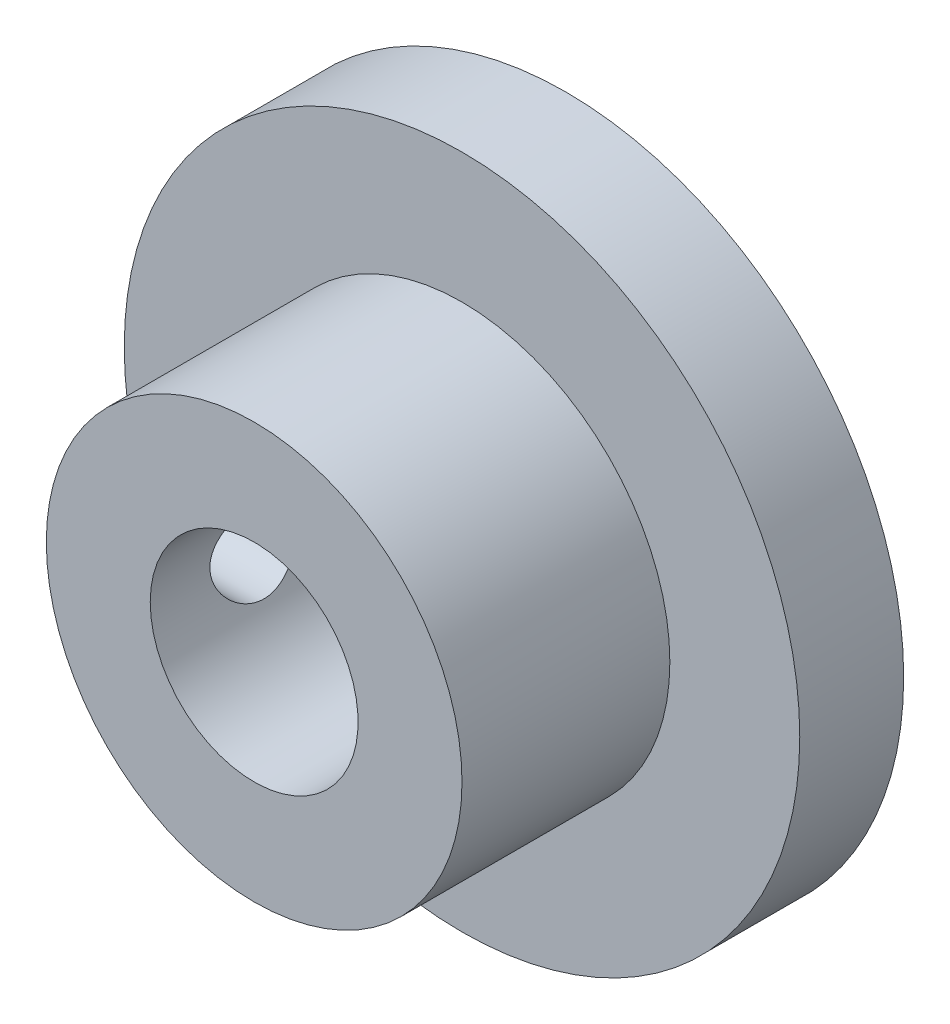
ISO-10303-21;
HEADER;
FILE_DESCRIPTION(('STEP AP214'),'2;1');
FILE_NAME('part.step','',(''),(''),'','','');
FILE_SCHEMA(('AUTOMOTIVE_DESIGN { 1 0 10303 214 1 1 1 1 }'));
ENDSEC;
DATA;
#1=APPLICATION_CONTEXT('core data for automotive mechanical design processes');
#2=APPLICATION_PROTOCOL_DEFINITION('international standard','automotive_design',2000,#1);
#3=PRODUCT_CONTEXT('',#1,'mechanical');
#4=PRODUCT('Part','Part','',(#3));
#5=PRODUCT_RELATED_PRODUCT_CATEGORY('part','',(#4));
#6=PRODUCT_DEFINITION_FORMATION('','',#4);
#7=PRODUCT_DEFINITION_CONTEXT('part definition',#1,'design');
#8=PRODUCT_DEFINITION('design','',#6,#7);
#9=PRODUCT_DEFINITION_SHAPE('','',#8);
#10=(LENGTH_UNIT() NAMED_UNIT(*) SI_UNIT(.MILLI.,.METRE.));
#11=(NAMED_UNIT(*) PLANE_ANGLE_UNIT() SI_UNIT($,.RADIAN.));
#12=(NAMED_UNIT(*) SI_UNIT($,.STERADIAN.) SOLID_ANGLE_UNIT());
#13=UNCERTAINTY_MEASURE_WITH_UNIT(LENGTH_MEASURE(1.E-05),#10,'distance_accuracy_value','');
#14=(GEOMETRIC_REPRESENTATION_CONTEXT(3) GLOBAL_UNCERTAINTY_ASSIGNED_CONTEXT((#13)) GLOBAL_UNIT_ASSIGNED_CONTEXT((#10,
#11,#12)) REPRESENTATION_CONTEXT('',''));
#15=CARTESIAN_POINT('',(0.,0.,0.));
#16=DIRECTION('',(0.,0.,1.));
#17=DIRECTION('',(1.,0.,0.));
#18=AXIS2_PLACEMENT_3D('',#15,#16,#17);
#19=CARTESIAN_POINT('',(0.,0.,3.175));
#20=DIRECTION('',(0.,0.,-1.));
#21=DIRECTION('',(-1.,0.,0.));
#22=AXIS2_PLACEMENT_3D('',#19,#20,#21);
#23=CYLINDRICAL_SURFACE('',#22,10.31875);
#24=CARTESIAN_POINT('',(0.,0.,3.175));
#25=DIRECTION('',(0.,0.,1.));
#26=DIRECTION('',(1.,0.,0.));
#27=AXIS2_PLACEMENT_3D('',#24,#25,#26);
#28=CIRCLE('',#27,10.31875);
#29=CARTESIAN_POINT('',(10.31875,0.,3.175));
#30=VERTEX_POINT('',#29);
#31=EDGE_CURVE('E54',#30,#30,#28,.T.);
#32=ORIENTED_EDGE('',*,*,#31,.F.);
#33=EDGE_LOOP('',(#32));
#34=FACE_BOUND('',#33,.T.);
#35=CARTESIAN_POINT('',(0.,0.,0.));
#36=DIRECTION('',(0.,0.,1.));
#37=DIRECTION('',(1.,0.,0.));
#38=AXIS2_PLACEMENT_3D('',#35,#36,#37);
#39=CIRCLE('',#38,10.31875);
#40=CARTESIAN_POINT('',(10.31875,0.,0.));
#41=VERTEX_POINT('',#40);
#42=EDGE_CURVE('E50',#41,#41,#39,.T.);
#43=ORIENTED_EDGE('',*,*,#42,.T.);
#44=EDGE_LOOP('',(#43));
#45=FACE_BOUND('',#44,.T.);
#46=ADVANCED_FACE('F47',(#34,#45),#23,.T.);
#47=CARTESIAN_POINT('',(0.,0.,3.175));
#48=DIRECTION('',(0.,0.,1.));
#49=DIRECTION('',(1.,0.,0.));
#50=AXIS2_PLACEMENT_3D('',#47,#48,#49);
#51=PLANE('',#50);
#52=CARTESIAN_POINT('',(0.,0.,3.175));
#53=DIRECTION('',(0.,0.,1.));
#54=DIRECTION('',(1.,0.,0.));
#55=AXIS2_PLACEMENT_3D('',#52,#53,#54);
#56=CIRCLE('',#55,6.35);
#57=CARTESIAN_POINT('',(6.35,0.,3.175));
#58=VERTEX_POINT('',#57);
#59=EDGE_CURVE('E12',#58,#58,#56,.T.);
#60=ORIENTED_EDGE('',*,*,#59,.F.);
#61=EDGE_LOOP('',(#60));
#62=FACE_BOUND('',#61,.T.);
#63=ORIENTED_EDGE('',*,*,#31,.T.);
#64=EDGE_LOOP('',(#63));
#65=FACE_BOUND('',#64,.T.);
#66=ADVANCED_FACE('F106',(#62,#65),#51,.T.);
#67=CARTESIAN_POINT('',(0.,0.,0.));
#68=DIRECTION('',(0.,0.,1.));
#69=DIRECTION('',(1.,0.,0.));
#70=AXIS2_PLACEMENT_3D('',#67,#68,#69);
#71=PLANE('',#70);
#72=CARTESIAN_POINT('',(0.,0.,0.));
#73=DIRECTION('',(0.,0.,-1.));
#74=DIRECTION('',(-1.,0.,0.));
#75=AXIS2_PLACEMENT_3D('',#72,#73,#74);
#76=CIRCLE('',#75,3.175);
#77=CARTESIAN_POINT('',(-3.175,0.,0.));
#78=VERTEX_POINT('',#77);
#79=EDGE_CURVE('E64',#78,#78,#76,.T.);
#80=ORIENTED_EDGE('',*,*,#79,.F.);
#81=EDGE_LOOP('',(#80));
#82=FACE_BOUND('',#81,.T.);
#83=ORIENTED_EDGE('',*,*,#42,.F.);
#84=EDGE_LOOP('',(#83));
#85=FACE_BOUND('',#84,.T.);
#86=ADVANCED_FACE('F102',(#82,#85),#71,.F.);
#87=CARTESIAN_POINT('',(0.,0.,9.525));
#88=DIRECTION('',(0.,0.,-1.));
#89=DIRECTION('',(-1.,0.,0.));
#90=AXIS2_PLACEMENT_3D('',#87,#88,#89);
#91=CYLINDRICAL_SURFACE('',#90,6.35);
#92=CARTESIAN_POINT('',(-6.35,0.,7.70255));
#93=CARTESIAN_POINT('',(-6.34999861096237,-0.0750646140818434,7.70254737073417));
#94=CARTESIAN_POINT('',(-6.34865540088408,-0.150161450028055,7.69627992657758));
#95=CARTESIAN_POINT('',(-6.34342675076644,-0.298225296339674,7.67139984164008));
#96=CARTESIAN_POINT('',(-6.33953943023363,-0.371190689529797,7.65277806894851));
#97=CARTESIAN_POINT('',(-6.32965577699744,-0.512830125656907,7.603796439198));
#98=CARTESIAN_POINT('',(-6.32366159067733,-0.581508452531715,7.57344852510907));
#99=CARTESIAN_POINT('',(-6.31021261659612,-0.712795420037444,7.5019132358319));
#100=CARTESIAN_POINT('',(-6.30275788196482,-0.77540428133116,7.46072625491349));
#101=CARTESIAN_POINT('',(-6.28707845908267,-0.893733729529972,7.36801641240627));
#102=CARTESIAN_POINT('',(-6.27884463503177,-0.949348399501572,7.31635989745548));
#103=CARTESIAN_POINT('',(-6.26260005999281,-1.05119276861777,7.20446437873646));
#104=CARTESIAN_POINT('',(-6.25458932813968,-1.09742166485733,7.14422464146688));
#105=CARTESIAN_POINT('',(-6.23960815322762,-1.17964434517394,7.01609621196687));
#106=CARTESIAN_POINT('',(-6.23264943245589,-1.21552634219632,6.94813429098301));
#107=CARTESIAN_POINT('',(-6.22069088315544,-1.27531989778063,6.80697282167515));
#108=CARTESIAN_POINT('',(-6.21569083337163,-1.29923280847738,6.73377386604163));
#109=CARTESIAN_POINT('',(-6.20830861045501,-1.33406128746238,6.58536223184559));
#110=CARTESIAN_POINT('',(-6.20588881195717,-1.34516385912344,6.51019534927045));
#111=CARTESIAN_POINT('',(-6.20382799290792,-1.35463777151121,6.35902984251258));
#112=CARTESIAN_POINT('',(-6.20418664902391,-1.35301059361624,6.28303131613722));
#113=CARTESIAN_POINT('',(-6.20760811333917,-1.33722190727113,6.13374306124383));
#114=CARTESIAN_POINT('',(-6.2106242486392,-1.32327672735781,6.06042922291285));
#115=CARTESIAN_POINT('',(-6.21894713261562,-1.28359022137343,5.91720610345467));
#116=CARTESIAN_POINT('',(-6.22425400382448,-1.25784826428298,5.84729700467113));
#117=CARTESIAN_POINT('',(-6.23660694361686,-1.19509780651165,5.71225487729554));
#118=CARTESIAN_POINT('',(-6.24366590013669,-1.15800532064544,5.64716210229017));
#119=CARTESIAN_POINT('',(-6.25871962533893,-1.07366584098501,5.52404430904634));
#120=CARTESIAN_POINT('',(-6.2667145152598,-1.02641753096658,5.46602020845719));
#121=CARTESIAN_POINT('',(-6.2829401548711,-0.921958343447951,5.35744048769627));
#122=CARTESIAN_POINT('',(-6.29117238219288,-0.864563295807785,5.30706210282791));
#123=CARTESIAN_POINT('',(-6.30679580872777,-0.742047254963459,5.21661794179964));
#124=CARTESIAN_POINT('',(-6.31418699419339,-0.676926135506122,5.17655233419665));
#125=CARTESIAN_POINT('',(-6.32731762757995,-0.540596304673301,5.10783073935462));
#126=CARTESIAN_POINT('',(-6.3330538427319,-0.46937602644303,5.07919704156644));
#127=CARTESIAN_POINT('',(-6.34220404917476,-0.322985870928896,5.03435198574641));
#128=CARTESIAN_POINT('',(-6.34561836032497,-0.247816539193657,5.01813891664289));
#129=CARTESIAN_POINT('',(-6.34969483950221,-0.0971831975907133,4.99885097050666));
#130=CARTESIAN_POINT('',(-6.35040774522148,-0.021751538849418,4.99553385095834));
#131=CARTESIAN_POINT('',(-6.34914287490065,0.128588082469587,5.00147669974056));
#132=CARTESIAN_POINT('',(-6.34716527145521,0.203496078330147,5.01073586130961));
#133=CARTESIAN_POINT('',(-6.34077352324428,0.349866034457528,5.04136743385906));
#134=CARTESIAN_POINT('',(-6.33638477329703,0.421355609891958,5.06261365582203));
#135=CARTESIAN_POINT('',(-6.32566160887462,0.559756726901239,5.11647686686692));
#136=CARTESIAN_POINT('',(-6.319327034669,0.626667892088092,5.14909478946832));
#137=CARTESIAN_POINT('',(-6.30528928586048,0.755020804805225,5.22528628571363));
#138=CARTESIAN_POINT('',(-6.29756861532476,0.816375459390216,5.2690032828613));
#139=CARTESIAN_POINT('',(-6.28165242253472,0.930964829041667,5.3659621104687));
#140=CARTESIAN_POINT('',(-6.2734568420981,0.984198546279221,5.4192051096557));
#141=CARTESIAN_POINT('',(-6.2573405892671,1.08198553722146,5.53481349998989));
#142=CARTESIAN_POINT('',(-6.2494271894923,1.1263715051453,5.59732160373991));
#143=CARTESIAN_POINT('',(-6.23493483661359,1.20401575994887,5.72904773091926));
#144=CARTESIAN_POINT('',(-6.22835582689793,1.23727451894147,5.79826546950683));
#145=CARTESIAN_POINT('',(-6.21733781696005,1.29150180342355,5.94108031915002));
#146=CARTESIAN_POINT('',(-6.21288706126121,1.31253798284658,6.01465079056798));
#147=CARTESIAN_POINT('',(-6.2066070485769,1.34192355845653,6.16438861944233));
#148=CARTESIAN_POINT('',(-6.20477739714954,1.35027486356241,6.24055558439385));
#149=CARTESIAN_POINT('',(-6.20397068907972,1.35397567572369,6.39163973219357));
#150=CARTESIAN_POINT('',(-6.20493549674238,1.34959015346798,6.46655023703136));
#151=CARTESIAN_POINT('',(-6.2094780181016,1.32853178134123,6.61453887630111));
#152=CARTESIAN_POINT('',(-6.21305570424062,1.31185906106091,6.68761703005012));
#153=CARTESIAN_POINT('',(-6.22239325528924,1.26682455867663,6.82966923948335));
#154=CARTESIAN_POINT('',(-6.22814627217719,1.23849943440763,6.89865539651984));
#155=CARTESIAN_POINT('',(-6.24118930990987,1.17099639387991,7.03093635025732));
#156=CARTESIAN_POINT('',(-6.24847948123034,1.13181741499343,7.09423058889684));
#157=CARTESIAN_POINT('',(-6.26395040356261,1.04283172893201,7.21464141782745));
#158=CARTESIAN_POINT('',(-6.27214556837561,0.992835380639869,7.27161603459636));
#159=CARTESIAN_POINT('',(-6.2884042122436,0.884020822113278,7.37645398581748));
#160=CARTESIAN_POINT('',(-6.29646766049922,0.825200580420685,7.42431521639077));
#161=CARTESIAN_POINT('',(-6.31167047796941,0.699546337421047,7.51012290218367));
#162=CARTESIAN_POINT('',(-6.31879741398043,0.632623562218123,7.54794167619793));
#163=CARTESIAN_POINT('',(-6.33120028356375,0.493235348200113,7.61173467200623));
#164=CARTESIAN_POINT('',(-6.33647780542986,0.420774730811315,7.63771906305292));
#165=CARTESIAN_POINT('',(-6.34361905124058,0.2901768273112,7.67234743478013));
#166=CARTESIAN_POINT('',(-6.34599734619059,0.232758269670466,7.68365224038747));
#167=CARTESIAN_POINT('',(-6.34918833005957,0.11689962831609,7.69875439627315));
#168=CARTESIAN_POINT('',(-6.35000108176889,0.0584595856667479,7.70255204764645));
#169=CARTESIAN_POINT('',(-6.35,0.,7.70255));
#170=B_SPLINE_CURVE_WITH_KNOTS('',3,(#92,#93,#94,#95,#96,#97,#98,#99,#100,#101,#102,#103,#104,
#105,#106,#107,#108,#109,#110,#111,#112,#113,#114,#115,#116,#117,#118,#119,#120,#121,#122,#123,
#124,#125,#126,#127,#128,#129,#130,#131,#132,#133,#134,#135,#136,#137,#138,#139,#140,#141,#142,
#143,#144,#145,#146,#147,#148,#149,#150,#151,#152,#153,#154,#155,#156,#157,#158,#159,#160,#161,
#162,#163,#164,#165,#166,#167,#168,#169),.UNSPECIFIED.,.T.,.F.,(4,2,2,2,2,2,2,2,2,2,2,2,2,2,2,2,
2,2,2,2,2,2,2,2,2,2,2,2,2,2,2,2,2,2,2,2,2,2,4),(0.,0.224979895980791,0.450126275209805,
0.67504394674997,0.899953438065847,1.12793886928433,1.355943795283,1.58632693132888,
1.81668403536191,2.04363409247308,2.27055773948938,2.4935736737059,2.71660153862233,
2.94132126356155,3.16607013040717,3.39542056996826,3.62477475790389,3.85457397221981,
4.08434152359174,4.3097715649296,4.53518714573762,4.75827288077634,4.98137693356216,
5.20752538847284,5.43370160816211,5.66381649384172,5.89392161481026,6.12274062574887,
6.35152519880278,6.57558456164184,6.79964156140387,7.02299901575426,7.24637834526044,
7.47404733340155,7.70176881671732,7.93226022587937,8.16255319898055,8.33777236451397,
8.51298450226032),.UNSPECIFIED.);
#171=CARTESIAN_POINT('',(-6.35,0.,7.70255));
#172=VERTEX_POINT('',#171);
#173=EDGE_CURVE('E67',#172,#172,#170,.T.);
#174=ORIENTED_EDGE('',*,*,#173,.T.);
#175=EDGE_LOOP('',(#174));
#176=FACE_BOUND('',#175,.T.);
#177=CARTESIAN_POINT('',(0.,0.,9.525));
#178=DIRECTION('',(0.,0.,1.));
#179=DIRECTION('',(1.,0.,0.));
#180=AXIS2_PLACEMENT_3D('',#177,#178,#179);
#181=CIRCLE('',#180,6.35);
#182=CARTESIAN_POINT('',(6.35,0.,9.525));
#183=VERTEX_POINT('',#182);
#184=EDGE_CURVE('E60',#183,#183,#181,.T.);
#185=ORIENTED_EDGE('',*,*,#184,.F.);
#186=EDGE_LOOP('',(#185));
#187=FACE_BOUND('',#186,.T.);
#188=ORIENTED_EDGE('',*,*,#59,.T.);
#189=EDGE_LOOP('',(#188));
#190=FACE_BOUND('',#189,.T.);
#191=ADVANCED_FACE('F82',(#176,#187,#190),#91,.T.);
#192=CARTESIAN_POINT('',(0.,0.,9.525));
#193=DIRECTION('',(0.,0.,1.));
#194=DIRECTION('',(1.,0.,0.));
#195=AXIS2_PLACEMENT_3D('',#192,#193,#194);
#196=PLANE('',#195);
#197=CARTESIAN_POINT('',(0.,0.,9.525));
#198=DIRECTION('',(0.,0.,-1.));
#199=DIRECTION('',(-1.,0.,0.));
#200=AXIS2_PLACEMENT_3D('',#197,#198,#199);
#201=CIRCLE('',#200,3.175);
#202=CARTESIAN_POINT('',(-3.175,0.,9.525));
#203=VERTEX_POINT('',#202);
#204=EDGE_CURVE('E63',#203,#203,#201,.T.);
#205=ORIENTED_EDGE('',*,*,#204,.T.);
#206=EDGE_LOOP('',(#205));
#207=FACE_BOUND('',#206,.T.);
#208=ORIENTED_EDGE('',*,*,#184,.T.);
#209=EDGE_LOOP('',(#208));
#210=FACE_BOUND('',#209,.T.);
#211=ADVANCED_FACE('F95',(#207,#210),#196,.T.);
#212=CARTESIAN_POINT('',(0.,0.,9.525));
#213=DIRECTION('',(0.,0.,-1.));
#214=DIRECTION('',(-1.,0.,0.));
#215=AXIS2_PLACEMENT_3D('',#212,#213,#214);
#216=CYLINDRICAL_SURFACE('',#215,3.175);
#217=CARTESIAN_POINT('',(-3.175,0.,7.70255));
#218=CARTESIAN_POINT('',(-3.1749937642741,0.0723119803182968,7.70254177520316));
#219=CARTESIAN_POINT('',(-3.17250122265995,0.144730355969441,7.69671677085275));
#220=CARTESIAN_POINT('',(-3.16277066799621,0.287508253069319,7.67362700946327));
#221=CARTESIAN_POINT('',(-3.15552058505164,0.357862061157262,7.65633315473188));
#222=CARTESIAN_POINT('',(-3.13705242394937,0.494208939922366,7.61106652134826));
#223=CARTESIAN_POINT('',(-3.12584804282756,0.560216141686439,7.58313057893921));
#224=CARTESIAN_POINT('',(-3.1005551810215,0.686540807637017,7.51752831329107));
#225=CARTESIAN_POINT('',(-3.0864675019097,0.746859846370328,7.47986469363826));
#226=CARTESIAN_POINT('',(-3.05599084668588,0.863330621553543,7.3938105223501));
#227=CARTESIAN_POINT('',(-3.03952431771545,0.919148042993752,7.34499522263455));
#228=CARTESIAN_POINT('',(-3.00647271455961,1.02209379973983,7.23892253623825));
#229=CARTESIAN_POINT('',(-2.98988758046311,1.06921736595388,7.18166054685898));
#230=CARTESIAN_POINT('',(-2.95750917471473,1.15586188650404,7.05671614571851));
#231=CARTESIAN_POINT('',(-2.94180185247632,1.19486044876668,6.98864683913289));
#232=CARTESIAN_POINT('',(-2.91419493098839,1.26070499788386,6.84615021576441));
#233=CARTESIAN_POINT('',(-2.90229328389849,1.28755752377759,6.77172634579415));
#234=CARTESIAN_POINT('',(-2.88448854081883,1.32695137173236,6.62248178209826));
#235=CARTESIAN_POINT('',(-2.87831670118836,1.34013766580825,6.54786466649272));
#236=CARTESIAN_POINT('',(-2.87190163928982,1.35383505668087,6.39724141107698));
#237=CARTESIAN_POINT('',(-2.87165493063134,1.35435360727363,6.32123611443425));
#238=CARTESIAN_POINT('',(-2.87689162283199,1.34318495882507,6.17655646216194));
#239=CARTESIAN_POINT('',(-2.88191351336426,1.3324808719224,6.10778608927004));
#240=CARTESIAN_POINT('',(-2.89633861211708,1.30082548820464,5.97313102087289));
#241=CARTESIAN_POINT('',(-2.90574270501209,1.27987212223332,5.9072469109829));
#242=CARTESIAN_POINT('',(-2.92808748949866,1.22790087368373,5.77853272243311));
#243=CARTESIAN_POINT('',(-2.94110054344015,1.19667432188826,5.71580002824039));
#244=CARTESIAN_POINT('',(-2.96918199373291,1.12519137808888,5.59621377419416));
#245=CARTESIAN_POINT('',(-2.98425121955486,1.08493133768207,5.53936260333507));
#246=CARTESIAN_POINT('',(-3.01637253593642,0.9923339499282,5.42784411343625));
#247=CARTESIAN_POINT('',(-3.03348193205179,0.939241995039338,5.37381804789814));
#248=CARTESIAN_POINT('',(-3.06663259637418,0.824589839165174,5.27521552840121));
#249=CARTESIAN_POINT('',(-3.08267359069275,0.763027479068143,5.23064149115567));
#250=CARTESIAN_POINT('',(-3.11238486879188,0.63115799860415,5.15120918261834));
#251=CARTESIAN_POINT('',(-3.12598548270222,0.560670064560461,5.11662308137786));
#252=CARTESIAN_POINT('',(-3.14874388156016,0.414148596926306,5.06002704250685));
#253=CARTESIAN_POINT('',(-3.15790423558693,0.33811829944544,5.03800983135907));
#254=CARTESIAN_POINT('',(-3.17026332558042,0.188019452335297,5.00854491934094));
#255=CARTESIAN_POINT('',(-3.17381325962292,0.114148617869651,5.0002373446985));
#256=CARTESIAN_POINT('',(-3.17568105366636,-0.0340114282148159,4.99584992680004));
#257=CARTESIAN_POINT('',(-3.17400050350427,-0.108300505854283,4.99976636798234));
#258=CARTESIAN_POINT('',(-3.16582243599864,-0.251086365945456,5.01911043997587));
#259=CARTESIAN_POINT('',(-3.15958185757468,-0.319682718417006,5.03392433271249));
#260=CARTESIAN_POINT('',(-3.14319082038792,-0.453335115246511,5.07377756726435));
#261=CARTESIAN_POINT('',(-3.13303987341454,-0.518390716382746,5.09881818591264));
#262=CARTESIAN_POINT('',(-3.10940117061925,-0.645410792119004,5.15922832667114));
#263=CARTESIAN_POINT('',(-3.09581917390959,-0.707215459370454,5.19489577974538));
#264=CARTESIAN_POINT('',(-3.06675439613932,-0.824184879794796,5.27522103608394));
#265=CARTESIAN_POINT('',(-3.05127080824472,-0.879346794690438,5.31988266069994));
#266=CARTESIAN_POINT('',(-3.01863676563666,-0.985790778724581,5.42081760274854));
#267=CARTESIAN_POINT('',(-3.00144808863402,-1.03647723077649,5.47770827444718));
#268=CARTESIAN_POINT('',(-2.96835692538155,-1.12776122684815,5.59944302368866));
#269=CARTESIAN_POINT('',(-2.95245478278206,-1.16835608123138,5.66428921469234));
#270=CARTESIAN_POINT('',(-2.92358303045918,-1.23885812859457,5.80165757409286));
#271=CARTESIAN_POINT('',(-2.91066826625578,-1.26857052110254,5.87429211735658));
#272=CARTESIAN_POINT('',(-2.88995701757537,-1.31507928002952,6.02425935932626));
#273=CARTESIAN_POINT('',(-2.88215605454428,-1.3318869503345,6.10158788211573));
#274=CARTESIAN_POINT('',(-2.87326066425685,-1.35096216089002,6.2521089835159));
#275=CARTESIAN_POINT('',(-2.87168133184628,-1.35428166989025,6.32514007908179));
#276=CARTESIAN_POINT('',(-2.87410980516818,-1.34912066967993,6.47068163722144));
#277=CARTESIAN_POINT('',(-2.87811665484049,-1.34064217966592,6.54319218675054));
#278=CARTESIAN_POINT('',(-2.89081435572085,-1.31302255224126,6.68182444023977));
#279=CARTESIAN_POINT('',(-2.89925667251005,-1.29444551613291,6.74808352632024));
#280=CARTESIAN_POINT('',(-2.91966810669131,-1.24772175082134,6.87655240125548));
#281=CARTESIAN_POINT('',(-2.93163822413924,-1.21957230769734,6.93876103578051));
#282=CARTESIAN_POINT('',(-2.95866974170816,-1.15251036671548,7.06154945594293));
#283=CARTESIAN_POINT('',(-2.97387612153679,-1.1130417786036,7.12179297640017));
#284=CARTESIAN_POINT('',(-3.00528179589943,-1.02522167499385,7.23513050272946));
#285=CARTESIAN_POINT('',(-3.0214814577203,-0.976866860266104,7.28822184044812));
#286=CARTESIAN_POINT('',(-3.05455722211636,-0.868199860048702,7.38999082551859));
#287=CARTESIAN_POINT('',(-3.07138832065964,-0.807251096145338,7.43800664347723));
#288=CARTESIAN_POINT('',(-3.10257916482516,-0.677547032947666,7.52317457940271));
#289=CARTESIAN_POINT('',(-3.11693778833812,-0.60878821250422,7.56032177006529));
#290=CARTESIAN_POINT('',(-3.14138312017248,-0.466349244720165,7.62194468564941));
#291=CARTESIAN_POINT('',(-3.15153079407947,-0.392758601835344,7.64660247811649));
#292=CARTESIAN_POINT('',(-3.16665584269732,-0.24207828385414,7.68295039769719));
#293=CARTESIAN_POINT('',(-3.17164926980853,-0.165000257484025,7.69468079369904));
#294=CARTESIAN_POINT('',(-3.17459936321147,-0.0584013278768096,7.70160755828298));
#295=CARTESIAN_POINT('',(-3.17500251882829,-0.0292093438574405,7.70255332228377));
#296=CARTESIAN_POINT('',(-3.175,0.,7.70255));
#297=B_SPLINE_CURVE_WITH_KNOTS('',3,(#217,#218,#219,#220,#221,#222,#223,#224,#225,#226,#227,
#228,#229,#230,#231,#232,#233,#234,#235,#236,#237,#238,#239,#240,#241,#242,#243,#244,#245,#246,
#247,#248,#249,#250,#251,#252,#253,#254,#255,#256,#257,#258,#259,#260,#261,#262,#263,#264,#265,
#266,#267,#268,#269,#270,#271,#272,#273,#274,#275,#276,#277,#278,#279,#280,#281,#282,#283,#284,
#285,#286,#287,#288,#289,#290,#291,#292,#293,#294,#295,#296),.UNSPECIFIED.,.T.,.F.,(4,2,2,2,2,2,
2,2,2,2,2,2,2,2,2,2,2,2,2,2,2,2,2,2,2,2,2,2,2,2,2,2,2,2,2,2,2,2,2,4),(0.,0.216850050638944,
0.434252388523416,0.650908954368241,0.867505370130752,1.09439609589244,1.32141091689532,
1.56022386511507,1.79890809057365,2.02572902648839,2.25241649603317,2.46078251280768,
2.66919061253204,2.88212426261053,3.0951440666222,3.32706321416167,3.55904158793932,
3.79684693152949,4.03451451918156,4.25661426582137,4.47864651050859,4.68904802527597,
4.89947581724864,5.11647002970508,5.33355663169255,5.56682347195774,5.80015241655904,
6.03747459229678,6.27458864785546,6.49280702774581,6.71098806472671,6.91807492424947,
7.12522054501713,7.34512352029503,7.56510830550803,7.80215736760164,8.0393137302226,
8.27290548905711,8.50576753373726,8.59336087119996),.UNSPECIFIED.);
#298=CARTESIAN_POINT('',(-3.175,0.,7.70255));
#299=VERTEX_POINT('',#298);
#300=EDGE_CURVE('E77',#299,#299,#297,.T.);
#301=ORIENTED_EDGE('',*,*,#300,.T.);
#302=EDGE_LOOP('',(#301));
#303=FACE_BOUND('',#302,.T.);
#304=ORIENTED_EDGE('',*,*,#204,.F.);
#305=EDGE_LOOP('',(#304));
#306=FACE_BOUND('',#305,.T.);
#307=ORIENTED_EDGE('',*,*,#79,.T.);
#308=EDGE_LOOP('',(#307));
#309=FACE_BOUND('',#308,.T.);
#310=ADVANCED_FACE('F89',(#303,#306,#309),#216,.F.);
#311=CARTESIAN_POINT('',(-6.35,0.,6.35));
#312=DIRECTION('',(-1.,0.,0.));
#313=DIRECTION('',(0.,0.,1.));
#314=AXIS2_PLACEMENT_3D('',#311,#312,#313);
#315=CYLINDRICAL_SURFACE('',#314,1.35255);
#316=ORIENTED_EDGE('',*,*,#300,.F.);
#317=EDGE_LOOP('',(#316));
#318=FACE_BOUND('',#317,.T.);
#319=ORIENTED_EDGE('',*,*,#173,.F.);
#320=EDGE_LOOP('',(#319));
#321=FACE_BOUND('',#320,.T.);
#322=ADVANCED_FACE('F86',(#318,#321),#315,.F.);
#323=CLOSED_SHELL('',(#46,#66,#86,#191,#211,#310,#322));
#324=MANIFOLD_SOLID_BREP('B2',#323);
#325=ADVANCED_BREP_SHAPE_REPRESENTATION('',(#18,#324),#14);
#326=SHAPE_DEFINITION_REPRESENTATION(#9,#325);
ENDSEC;
END-ISO-10303-21;
